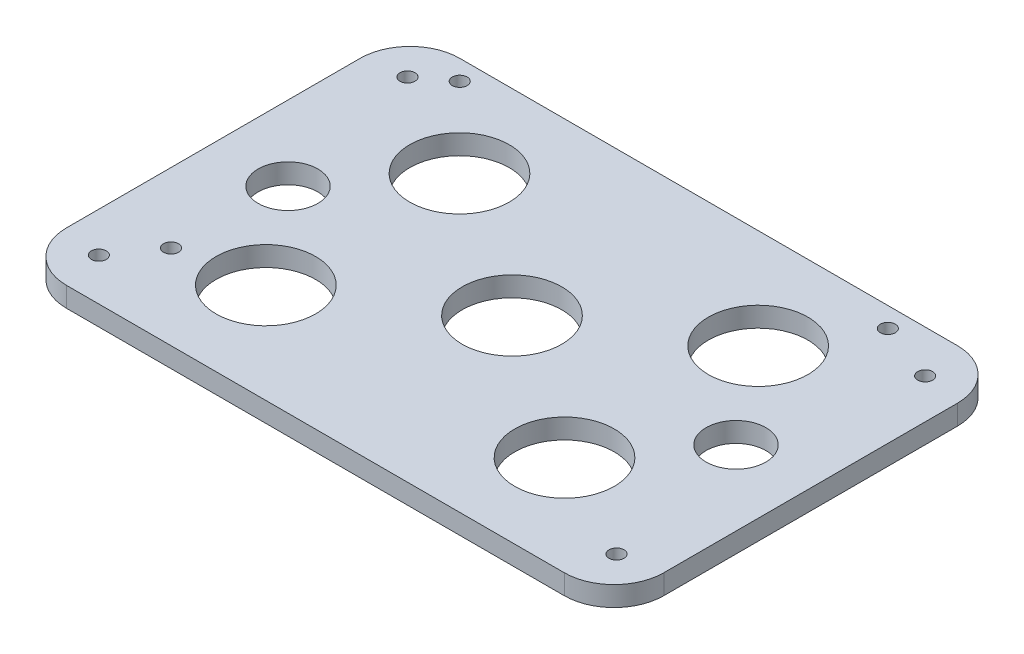
ISO-10303-21;
HEADER;
FILE_DESCRIPTION(('STEP AP214'),'2;1');
FILE_NAME('part.step','',(''),(''),'','','');
FILE_SCHEMA(('AUTOMOTIVE_DESIGN { 1 0 10303 214 1 1 1 1 }'));
ENDSEC;
DATA;
#1=APPLICATION_CONTEXT('core data for automotive mechanical design processes');
#2=APPLICATION_PROTOCOL_DEFINITION('international standard','automotive_design',2000,#1);
#3=PRODUCT_CONTEXT('',#1,'mechanical');
#4=PRODUCT('Part','Part','',(#3));
#5=PRODUCT_RELATED_PRODUCT_CATEGORY('part','',(#4));
#6=PRODUCT_DEFINITION_FORMATION('','',#4);
#7=PRODUCT_DEFINITION_CONTEXT('part definition',#1,'design');
#8=PRODUCT_DEFINITION('design','',#6,#7);
#9=PRODUCT_DEFINITION_SHAPE('','',#8);
#10=(LENGTH_UNIT() NAMED_UNIT(*) SI_UNIT(.MILLI.,.METRE.));
#11=(NAMED_UNIT(*) PLANE_ANGLE_UNIT() SI_UNIT($,.RADIAN.));
#12=(NAMED_UNIT(*) SI_UNIT($,.STERADIAN.) SOLID_ANGLE_UNIT());
#13=UNCERTAINTY_MEASURE_WITH_UNIT(LENGTH_MEASURE(1.E-05),#10,'distance_accuracy_value','');
#14=(GEOMETRIC_REPRESENTATION_CONTEXT(3) GLOBAL_UNCERTAINTY_ASSIGNED_CONTEXT((#13)) GLOBAL_UNIT_ASSIGNED_CONTEXT((#10,
#11,#12)) REPRESENTATION_CONTEXT('',''));
#15=CARTESIAN_POINT('',(0.,0.,0.));
#16=DIRECTION('',(0.,0.,1.));
#17=DIRECTION('',(1.,0.,0.));
#18=AXIS2_PLACEMENT_3D('',#15,#16,#17);
#19=CARTESIAN_POINT('',(-50.,4.,29.5));
#20=DIRECTION('',(0.,1.,0.));
#21=DIRECTION('',(0.,0.,1.));
#22=AXIS2_PLACEMENT_3D('',#19,#20,#21);
#23=PLANE('',#22);
#24=CARTESIAN_POINT('',(52.,4.,-31.));
#25=DIRECTION('',(0.,1.,0.));
#26=DIRECTION('',(0.,0.,1.));
#27=AXIS2_PLACEMENT_3D('',#24,#25,#26);
#28=CIRCLE('',#27,1.5);
#29=CARTESIAN_POINT('',(52.,4.,-29.5));
#30=VERTEX_POINT('',#29);
#31=EDGE_CURVE('E350',#30,#30,#28,.T.);
#32=ORIENTED_EDGE('',*,*,#31,.F.);
#33=EDGE_LOOP('',(#32));
#34=FACE_BOUND('',#33,.T.);
#35=CARTESIAN_POINT('',(52.,4.,31.));
#36=DIRECTION('',(0.,1.,0.));
#37=DIRECTION('',(0.,0.,1.));
#38=AXIS2_PLACEMENT_3D('',#35,#36,#37);
#39=CIRCLE('',#38,1.5);
#40=CARTESIAN_POINT('',(52.,4.,32.5));
#41=VERTEX_POINT('',#40);
#42=EDGE_CURVE('E346',#41,#41,#39,.T.);
#43=ORIENTED_EDGE('',*,*,#42,.F.);
#44=EDGE_LOOP('',(#43));
#45=FACE_BOUND('',#44,.T.);
#46=CARTESIAN_POINT('',(-52.,4.,31.));
#47=DIRECTION('',(0.,1.,0.));
#48=DIRECTION('',(0.,0.,1.));
#49=AXIS2_PLACEMENT_3D('',#46,#47,#48);
#50=CIRCLE('',#49,1.5);
#51=CARTESIAN_POINT('',(-52.,4.,32.5));
#52=VERTEX_POINT('',#51);
#53=EDGE_CURVE('E339',#52,#52,#50,.T.);
#54=ORIENTED_EDGE('',*,*,#53,.F.);
#55=EDGE_LOOP('',(#54));
#56=FACE_BOUND('',#55,.T.);
#57=CARTESIAN_POINT('',(-52.,4.,-31.));
#58=DIRECTION('',(0.,1.,0.));
#59=DIRECTION('',(0.,0.,1.));
#60=AXIS2_PLACEMENT_3D('',#57,#58,#59);
#61=CIRCLE('',#60,1.5);
#62=CARTESIAN_POINT('',(-52.,4.,-29.5));
#63=VERTEX_POINT('',#62);
#64=EDGE_CURVE('E167',#63,#63,#61,.T.);
#65=ORIENTED_EDGE('',*,*,#64,.F.);
#66=EDGE_LOOP('',(#65));
#67=FACE_BOUND('',#66,.T.);
#68=CARTESIAN_POINT('',(-45.,4.,0.));
#69=DIRECTION('',(0.,1.,0.));
#70=DIRECTION('',(0.,0.,1.));
#71=AXIS2_PLACEMENT_3D('',#68,#69,#70);
#72=CIRCLE('',#71,6.);
#73=CARTESIAN_POINT('',(-45.,4.,6.));
#74=VERTEX_POINT('',#73);
#75=EDGE_CURVE('E187',#74,#74,#72,.T.);
#76=ORIENTED_EDGE('',*,*,#75,.F.);
#77=EDGE_LOOP('',(#76));
#78=FACE_BOUND('',#77,.T.);
#79=CARTESIAN_POINT('',(-46.,4.,-35.5));
#80=DIRECTION('',(0.,1.,0.));
#81=DIRECTION('',(0.,0.,1.));
#82=AXIS2_PLACEMENT_3D('',#79,#80,#81);
#83=CIRCLE('',#82,1.5);
#84=CARTESIAN_POINT('',(-46.,4.,-34.));
#85=VERTEX_POINT('',#84);
#86=EDGE_CURVE('E199',#85,#85,#83,.T.);
#87=ORIENTED_EDGE('',*,*,#86,.F.);
#88=EDGE_LOOP('',(#87));
#89=FACE_BOUND('',#88,.T.);
#90=CARTESIAN_POINT('',(0.,4.,0.));
#91=DIRECTION('',(0.,1.,0.));
#92=DIRECTION('',(0.,0.,1.));
#93=AXIS2_PLACEMENT_3D('',#90,#91,#92);
#94=CIRCLE('',#93,10.);
#95=CARTESIAN_POINT('',(0.,4.,10.));
#96=VERTEX_POINT('',#95);
#97=EDGE_CURVE('E211',#96,#96,#94,.T.);
#98=ORIENTED_EDGE('',*,*,#97,.F.);
#99=EDGE_LOOP('',(#98));
#100=FACE_BOUND('',#99,.T.);
#101=CARTESIAN_POINT('',(30.,4.,-19.45));
#102=DIRECTION('',(0.,1.,0.));
#103=DIRECTION('',(0.,0.,1.));
#104=AXIS2_PLACEMENT_3D('',#101,#102,#103);
#105=CIRCLE('',#104,10.);
#106=CARTESIAN_POINT('',(30.,4.,-9.45));
#107=VERTEX_POINT('',#106);
#108=EDGE_CURVE('E223',#107,#107,#105,.T.);
#109=ORIENTED_EDGE('',*,*,#108,.F.);
#110=EDGE_LOOP('',(#109));
#111=FACE_BOUND('',#110,.T.);
#112=CARTESIAN_POINT('',(40.,4.,-35.5));
#113=DIRECTION('',(0.,1.,0.));
#114=DIRECTION('',(0.,0.,1.));
#115=AXIS2_PLACEMENT_3D('',#112,#113,#114);
#116=CIRCLE('',#115,1.5);
#117=CARTESIAN_POINT('',(40.,4.,-34.));
#118=VERTEX_POINT('',#117);
#119=EDGE_CURVE('E140',#118,#118,#116,.T.);
#120=ORIENTED_EDGE('',*,*,#119,.F.);
#121=EDGE_LOOP('',(#120));
#122=FACE_BOUND('',#121,.T.);
#123=CARTESIAN_POINT('',(-50.,4.,29.5));
#124=DIRECTION('',(0.,1.,0.));
#125=DIRECTION('',(0.,0.,1.));
#126=AXIS2_PLACEMENT_3D('',#123,#124,#125);
#127=CIRCLE('',#126,10.);
#128=CARTESIAN_POINT('',(-60.,4.,29.5));
#129=VERTEX_POINT('',#128);
#130=CARTESIAN_POINT('',(-50.,4.,39.5));
#131=VERTEX_POINT('',#130);
#132=EDGE_CURVE('E151',#129,#131,#127,.T.);
#133=ORIENTED_EDGE('',*,*,#132,.T.);
#134=DIRECTION('',(1.,0.,0.));
#135=VECTOR('',#134,1.);
#136=CARTESIAN_POINT('',(-50.,4.,39.5));
#137=LINE('',#136,#135);
#138=CARTESIAN_POINT('',(50.,4.,39.5));
#139=VERTEX_POINT('',#138);
#140=EDGE_CURVE('E99',#131,#139,#137,.T.);
#141=ORIENTED_EDGE('',*,*,#140,.T.);
#142=CARTESIAN_POINT('',(50.,4.,29.5));
#143=DIRECTION('',(0.,1.,0.));
#144=DIRECTION('',(0.,0.,1.));
#145=AXIS2_PLACEMENT_3D('',#142,#143,#144);
#146=CIRCLE('',#145,10.);
#147=CARTESIAN_POINT('',(60.,4.,29.5));
#148=VERTEX_POINT('',#147);
#149=EDGE_CURVE('E241',#139,#148,#146,.T.);
#150=ORIENTED_EDGE('',*,*,#149,.T.);
#151=DIRECTION('',(0.,0.,-1.));
#152=VECTOR('',#151,1.);
#153=CARTESIAN_POINT('',(60.,4.,29.5));
#154=LINE('',#153,#152);
#155=CARTESIAN_POINT('',(60.,4.,-29.5));
#156=VERTEX_POINT('',#155);
#157=EDGE_CURVE('E243',#148,#156,#154,.T.);
#158=ORIENTED_EDGE('',*,*,#157,.T.);
#159=CARTESIAN_POINT('',(50.,4.,-29.5));
#160=DIRECTION('',(0.,1.,0.));
#161=DIRECTION('',(0.,0.,1.));
#162=AXIS2_PLACEMENT_3D('',#159,#160,#161);
#163=CIRCLE('',#162,10.);
#164=CARTESIAN_POINT('',(50.,4.,-39.5));
#165=VERTEX_POINT('',#164);
#166=EDGE_CURVE('E118',#156,#165,#163,.T.);
#167=ORIENTED_EDGE('',*,*,#166,.T.);
#168=DIRECTION('',(-1.,0.,0.));
#169=VECTOR('',#168,1.);
#170=CARTESIAN_POINT('',(50.,4.,-39.5));
#171=LINE('',#170,#169);
#172=CARTESIAN_POINT('',(-50.,4.,-39.5));
#173=VERTEX_POINT('',#172);
#174=EDGE_CURVE('E112',#165,#173,#171,.T.);
#175=ORIENTED_EDGE('',*,*,#174,.T.);
#176=CARTESIAN_POINT('',(-50.,4.,-29.5));
#177=DIRECTION('',(0.,1.,0.));
#178=DIRECTION('',(0.,0.,1.));
#179=AXIS2_PLACEMENT_3D('',#176,#177,#178);
#180=CIRCLE('',#179,10.);
#181=CARTESIAN_POINT('',(-60.,4.,-29.5));
#182=VERTEX_POINT('',#181);
#183=EDGE_CURVE('E116',#173,#182,#180,.T.);
#184=ORIENTED_EDGE('',*,*,#183,.T.);
#185=DIRECTION('',(0.,0.,1.));
#186=VECTOR('',#185,1.);
#187=CARTESIAN_POINT('',(-60.,4.,-29.5));
#188=LINE('',#187,#186);
#189=EDGE_CURVE('E56',#182,#129,#188,.T.);
#190=ORIENTED_EDGE('',*,*,#189,.T.);
#191=EDGE_LOOP('',(#133,#141,#150,#158,#167,#175,#184,#190));
#192=FACE_BOUND('',#191,.T.);
#193=CARTESIAN_POINT('',(45.,4.,0.));
#194=DIRECTION('',(0.,1.,0.));
#195=DIRECTION('',(0.,0.,1.));
#196=AXIS2_PLACEMENT_3D('',#193,#194,#195);
#197=CIRCLE('',#196,6.);
#198=CARTESIAN_POINT('',(45.,4.,6.));
#199=VERTEX_POINT('',#198);
#200=EDGE_CURVE('E229',#199,#199,#197,.T.);
#201=ORIENTED_EDGE('',*,*,#200,.F.);
#202=EDGE_LOOP('',(#201));
#203=FACE_BOUND('',#202,.T.);
#204=CARTESIAN_POINT('',(30.,4.,19.45));
#205=DIRECTION('',(0.,1.,0.));
#206=DIRECTION('',(0.,0.,1.));
#207=AXIS2_PLACEMENT_3D('',#204,#205,#206);
#208=CIRCLE('',#207,10.);
#209=CARTESIAN_POINT('',(30.,4.,29.45));
#210=VERTEX_POINT('',#209);
#211=EDGE_CURVE('E217',#210,#210,#208,.T.);
#212=ORIENTED_EDGE('',*,*,#211,.F.);
#213=EDGE_LOOP('',(#212));
#214=FACE_BOUND('',#213,.T.);
#215=CARTESIAN_POINT('',(-30.,4.,19.45));
#216=DIRECTION('',(0.,1.,0.));
#217=DIRECTION('',(0.,0.,1.));
#218=AXIS2_PLACEMENT_3D('',#215,#216,#217);
#219=CIRCLE('',#218,10.);
#220=CARTESIAN_POINT('',(-30.,4.,29.45));
#221=VERTEX_POINT('',#220);
#222=EDGE_CURVE('E205',#221,#221,#219,.T.);
#223=ORIENTED_EDGE('',*,*,#222,.F.);
#224=EDGE_LOOP('',(#223));
#225=FACE_BOUND('',#224,.T.);
#226=CARTESIAN_POINT('',(-46.,4.,22.5));
#227=DIRECTION('',(0.,1.,0.));
#228=DIRECTION('',(0.,0.,1.));
#229=AXIS2_PLACEMENT_3D('',#226,#227,#228);
#230=CIRCLE('',#229,1.5);
#231=CARTESIAN_POINT('',(-46.,4.,24.));
#232=VERTEX_POINT('',#231);
#233=EDGE_CURVE('E193',#232,#232,#230,.T.);
#234=ORIENTED_EDGE('',*,*,#233,.F.);
#235=EDGE_LOOP('',(#234));
#236=FACE_BOUND('',#235,.T.);
#237=CARTESIAN_POINT('',(-30.,4.,-19.45));
#238=DIRECTION('',(0.,1.,0.));
#239=DIRECTION('',(0.,0.,1.));
#240=AXIS2_PLACEMENT_3D('',#237,#238,#239);
#241=CIRCLE('',#240,10.);
#242=CARTESIAN_POINT('',(-30.,4.,-9.45));
#243=VERTEX_POINT('',#242);
#244=EDGE_CURVE('E178',#243,#243,#241,.T.);
#245=ORIENTED_EDGE('',*,*,#244,.F.);
#246=EDGE_LOOP('',(#245));
#247=FACE_BOUND('',#246,.T.);
#248=ADVANCED_FACE('F37',(#34,#45,#56,#67,#78,#89,#100,#111,#122,#192,#203,#214,#225,#236,#247),
#23,.T.);
#249=CARTESIAN_POINT('',(-50.,0.,29.5));
#250=DIRECTION('',(0.,1.,0.));
#251=DIRECTION('',(0.,0.,1.));
#252=AXIS2_PLACEMENT_3D('',#249,#250,#251);
#253=PLANE('',#252);
#254=CARTESIAN_POINT('',(52.,0.,-31.));
#255=DIRECTION('',(0.,1.,0.));
#256=DIRECTION('',(0.,0.,1.));
#257=AXIS2_PLACEMENT_3D('',#254,#255,#256);
#258=CIRCLE('',#257,1.5);
#259=CARTESIAN_POINT('',(52.,0.,-29.5));
#260=VERTEX_POINT('',#259);
#261=EDGE_CURVE('E41',#260,#260,#258,.T.);
#262=ORIENTED_EDGE('',*,*,#261,.T.);
#263=EDGE_LOOP('',(#262));
#264=FACE_BOUND('',#263,.T.);
#265=CARTESIAN_POINT('',(52.,0.,31.));
#266=DIRECTION('',(0.,1.,0.));
#267=DIRECTION('',(0.,0.,1.));
#268=AXIS2_PLACEMENT_3D('',#265,#266,#267);
#269=CIRCLE('',#268,1.5);
#270=CARTESIAN_POINT('',(52.,0.,32.5));
#271=VERTEX_POINT('',#270);
#272=EDGE_CURVE('E169',#271,#271,#269,.T.);
#273=ORIENTED_EDGE('',*,*,#272,.T.);
#274=EDGE_LOOP('',(#273));
#275=FACE_BOUND('',#274,.T.);
#276=CARTESIAN_POINT('',(-52.,0.,31.));
#277=DIRECTION('',(0.,1.,0.));
#278=DIRECTION('',(0.,0.,1.));
#279=AXIS2_PLACEMENT_3D('',#276,#277,#278);
#280=CIRCLE('',#279,1.5);
#281=CARTESIAN_POINT('',(-52.,0.,32.5));
#282=VERTEX_POINT('',#281);
#283=EDGE_CURVE('E166',#282,#282,#280,.T.);
#284=ORIENTED_EDGE('',*,*,#283,.T.);
#285=EDGE_LOOP('',(#284));
#286=FACE_BOUND('',#285,.T.);
#287=CARTESIAN_POINT('',(-52.,0.,-31.));
#288=DIRECTION('',(0.,1.,0.));
#289=DIRECTION('',(0.,0.,1.));
#290=AXIS2_PLACEMENT_3D('',#287,#288,#289);
#291=CIRCLE('',#290,1.5);
#292=CARTESIAN_POINT('',(-52.,0.,-29.5));
#293=VERTEX_POINT('',#292);
#294=EDGE_CURVE('E163',#293,#293,#291,.T.);
#295=ORIENTED_EDGE('',*,*,#294,.T.);
#296=EDGE_LOOP('',(#295));
#297=FACE_BOUND('',#296,.T.);
#298=CARTESIAN_POINT('',(-50.,0.,29.5));
#299=DIRECTION('',(0.,1.,0.));
#300=DIRECTION('',(0.,0.,1.));
#301=AXIS2_PLACEMENT_3D('',#298,#299,#300);
#302=CIRCLE('',#301,10.);
#303=CARTESIAN_POINT('',(-60.,0.,29.5));
#304=VERTEX_POINT('',#303);
#305=CARTESIAN_POINT('',(-50.,0.,39.5));
#306=VERTEX_POINT('',#305);
#307=EDGE_CURVE('E136',#304,#306,#302,.T.);
#308=ORIENTED_EDGE('',*,*,#307,.F.);
#309=DIRECTION('',(0.,0.,1.));
#310=VECTOR('',#309,1.);
#311=CARTESIAN_POINT('',(-60.,0.,-29.5));
#312=LINE('',#311,#310);
#313=CARTESIAN_POINT('',(-60.,0.,-29.5));
#314=VERTEX_POINT('',#313);
#315=EDGE_CURVE('E91',#314,#304,#312,.T.);
#316=ORIENTED_EDGE('',*,*,#315,.F.);
#317=CARTESIAN_POINT('',(-50.,0.,-29.5));
#318=DIRECTION('',(0.,1.,0.));
#319=DIRECTION('',(0.,0.,1.));
#320=AXIS2_PLACEMENT_3D('',#317,#318,#319);
#321=CIRCLE('',#320,10.);
#322=CARTESIAN_POINT('',(-50.,0.,-39.5));
#323=VERTEX_POINT('',#322);
#324=EDGE_CURVE('E85',#323,#314,#321,.T.);
#325=ORIENTED_EDGE('',*,*,#324,.F.);
#326=DIRECTION('',(-1.,0.,0.));
#327=VECTOR('',#326,1.);
#328=CARTESIAN_POINT('',(50.,0.,-39.5));
#329=LINE('',#328,#327);
#330=CARTESIAN_POINT('',(50.,0.,-39.5));
#331=VERTEX_POINT('',#330);
#332=EDGE_CURVE('E126',#331,#323,#329,.T.);
#333=ORIENTED_EDGE('',*,*,#332,.F.);
#334=CARTESIAN_POINT('',(50.,0.,-29.5));
#335=DIRECTION('',(0.,1.,0.));
#336=DIRECTION('',(0.,0.,1.));
#337=AXIS2_PLACEMENT_3D('',#334,#335,#336);
#338=CIRCLE('',#337,10.);
#339=CARTESIAN_POINT('',(60.,0.,-29.5));
#340=VERTEX_POINT('',#339);
#341=EDGE_CURVE('E146',#340,#331,#338,.T.);
#342=ORIENTED_EDGE('',*,*,#341,.F.);
#343=DIRECTION('',(0.,0.,-1.));
#344=VECTOR('',#343,1.);
#345=CARTESIAN_POINT('',(60.,0.,29.5));
#346=LINE('',#345,#344);
#347=CARTESIAN_POINT('',(60.,0.,29.5));
#348=VERTEX_POINT('',#347);
#349=EDGE_CURVE('E144',#348,#340,#346,.T.);
#350=ORIENTED_EDGE('',*,*,#349,.F.);
#351=CARTESIAN_POINT('',(50.,0.,29.5));
#352=DIRECTION('',(0.,1.,0.));
#353=DIRECTION('',(0.,0.,1.));
#354=AXIS2_PLACEMENT_3D('',#351,#352,#353);
#355=CIRCLE('',#354,10.);
#356=CARTESIAN_POINT('',(50.,0.,39.5));
#357=VERTEX_POINT('',#356);
#358=EDGE_CURVE('E142',#357,#348,#355,.T.);
#359=ORIENTED_EDGE('',*,*,#358,.F.);
#360=DIRECTION('',(1.,0.,0.));
#361=VECTOR('',#360,1.);
#362=CARTESIAN_POINT('',(-50.,0.,39.5));
#363=LINE('',#362,#361);
#364=EDGE_CURVE('E139',#306,#357,#363,.T.);
#365=ORIENTED_EDGE('',*,*,#364,.F.);
#366=EDGE_LOOP('',(#308,#316,#325,#333,#342,#350,#359,#365));
#367=FACE_BOUND('',#366,.T.);
#368=CARTESIAN_POINT('',(40.,0.,-35.5));
#369=DIRECTION('',(0.,1.,0.));
#370=DIRECTION('',(0.,0.,1.));
#371=AXIS2_PLACEMENT_3D('',#368,#369,#370);
#372=CIRCLE('',#371,1.5);
#373=CARTESIAN_POINT('',(40.,0.,-34.));
#374=VERTEX_POINT('',#373);
#375=EDGE_CURVE('E232',#374,#374,#372,.T.);
#376=ORIENTED_EDGE('',*,*,#375,.T.);
#377=EDGE_LOOP('',(#376));
#378=FACE_BOUND('',#377,.T.);
#379=CARTESIAN_POINT('',(45.,0.,0.));
#380=DIRECTION('',(0.,1.,0.));
#381=DIRECTION('',(0.,0.,1.));
#382=AXIS2_PLACEMENT_3D('',#379,#380,#381);
#383=CIRCLE('',#382,6.);
#384=CARTESIAN_POINT('',(45.,0.,6.));
#385=VERTEX_POINT('',#384);
#386=EDGE_CURVE('E226',#385,#385,#383,.T.);
#387=ORIENTED_EDGE('',*,*,#386,.T.);
#388=EDGE_LOOP('',(#387));
#389=FACE_BOUND('',#388,.T.);
#390=CARTESIAN_POINT('',(30.,0.,-19.45));
#391=DIRECTION('',(0.,1.,0.));
#392=DIRECTION('',(0.,0.,1.));
#393=AXIS2_PLACEMENT_3D('',#390,#391,#392);
#394=CIRCLE('',#393,10.);
#395=CARTESIAN_POINT('',(30.,0.,-9.45));
#396=VERTEX_POINT('',#395);
#397=EDGE_CURVE('E220',#396,#396,#394,.T.);
#398=ORIENTED_EDGE('',*,*,#397,.T.);
#399=EDGE_LOOP('',(#398));
#400=FACE_BOUND('',#399,.T.);
#401=CARTESIAN_POINT('',(30.,0.,19.45));
#402=DIRECTION('',(0.,1.,0.));
#403=DIRECTION('',(0.,0.,1.));
#404=AXIS2_PLACEMENT_3D('',#401,#402,#403);
#405=CIRCLE('',#404,10.);
#406=CARTESIAN_POINT('',(30.,0.,29.45));
#407=VERTEX_POINT('',#406);
#408=EDGE_CURVE('E214',#407,#407,#405,.T.);
#409=ORIENTED_EDGE('',*,*,#408,.T.);
#410=EDGE_LOOP('',(#409));
#411=FACE_BOUND('',#410,.T.);
#412=CARTESIAN_POINT('',(0.,0.,0.));
#413=DIRECTION('',(0.,1.,0.));
#414=DIRECTION('',(0.,0.,1.));
#415=AXIS2_PLACEMENT_3D('',#412,#413,#414);
#416=CIRCLE('',#415,10.);
#417=CARTESIAN_POINT('',(0.,0.,10.));
#418=VERTEX_POINT('',#417);
#419=EDGE_CURVE('E208',#418,#418,#416,.T.);
#420=ORIENTED_EDGE('',*,*,#419,.T.);
#421=EDGE_LOOP('',(#420));
#422=FACE_BOUND('',#421,.T.);
#423=CARTESIAN_POINT('',(-30.,0.,19.45));
#424=DIRECTION('',(0.,1.,0.));
#425=DIRECTION('',(0.,0.,1.));
#426=AXIS2_PLACEMENT_3D('',#423,#424,#425);
#427=CIRCLE('',#426,10.);
#428=CARTESIAN_POINT('',(-30.,0.,29.45));
#429=VERTEX_POINT('',#428);
#430=EDGE_CURVE('E202',#429,#429,#427,.T.);
#431=ORIENTED_EDGE('',*,*,#430,.T.);
#432=EDGE_LOOP('',(#431));
#433=FACE_BOUND('',#432,.T.);
#434=CARTESIAN_POINT('',(-46.,0.,-35.5));
#435=DIRECTION('',(0.,1.,0.));
#436=DIRECTION('',(0.,0.,1.));
#437=AXIS2_PLACEMENT_3D('',#434,#435,#436);
#438=CIRCLE('',#437,1.5);
#439=CARTESIAN_POINT('',(-46.,0.,-34.));
#440=VERTEX_POINT('',#439);
#441=EDGE_CURVE('E196',#440,#440,#438,.T.);
#442=ORIENTED_EDGE('',*,*,#441,.T.);
#443=EDGE_LOOP('',(#442));
#444=FACE_BOUND('',#443,.T.);
#445=CARTESIAN_POINT('',(-46.,0.,22.5));
#446=DIRECTION('',(0.,1.,0.));
#447=DIRECTION('',(0.,0.,1.));
#448=AXIS2_PLACEMENT_3D('',#445,#446,#447);
#449=CIRCLE('',#448,1.5);
#450=CARTESIAN_POINT('',(-46.,0.,24.));
#451=VERTEX_POINT('',#450);
#452=EDGE_CURVE('E190',#451,#451,#449,.T.);
#453=ORIENTED_EDGE('',*,*,#452,.T.);
#454=EDGE_LOOP('',(#453));
#455=FACE_BOUND('',#454,.T.);
#456=CARTESIAN_POINT('',(-45.,0.,0.));
#457=DIRECTION('',(0.,1.,0.));
#458=DIRECTION('',(0.,0.,1.));
#459=AXIS2_PLACEMENT_3D('',#456,#457,#458);
#460=CIRCLE('',#459,6.);
#461=CARTESIAN_POINT('',(-45.,0.,6.));
#462=VERTEX_POINT('',#461);
#463=EDGE_CURVE('E183',#462,#462,#460,.T.);
#464=ORIENTED_EDGE('',*,*,#463,.T.);
#465=EDGE_LOOP('',(#464));
#466=FACE_BOUND('',#465,.T.);
#467=CARTESIAN_POINT('',(-30.,0.,-19.45));
#468=DIRECTION('',(0.,1.,0.));
#469=DIRECTION('',(0.,0.,1.));
#470=AXIS2_PLACEMENT_3D('',#467,#468,#469);
#471=CIRCLE('',#470,10.);
#472=CARTESIAN_POINT('',(-30.,0.,-9.45));
#473=VERTEX_POINT('',#472);
#474=EDGE_CURVE('E174',#473,#473,#471,.T.);
#475=ORIENTED_EDGE('',*,*,#474,.T.);
#476=EDGE_LOOP('',(#475));
#477=FACE_BOUND('',#476,.T.);
#478=ADVANCED_FACE('F256',(#264,#275,#286,#297,#367,#378,#389,#400,#411,#422,#433,#444,#455,
#466,#477),#253,.F.);
#479=CARTESIAN_POINT('',(-50.,4.,29.5));
#480=DIRECTION('',(0.,-1.,0.));
#481=DIRECTION('',(0.,0.,-1.));
#482=AXIS2_PLACEMENT_3D('',#479,#480,#481);
#483=CYLINDRICAL_SURFACE('',#482,10.);
#484=ORIENTED_EDGE('',*,*,#307,.T.);
#485=DIRECTION('',(0.,-1.,0.));
#486=VECTOR('',#485,1.);
#487=CARTESIAN_POINT('',(-50.,4.,39.5));
#488=LINE('',#487,#486);
#489=EDGE_CURVE('E11',#131,#306,#488,.T.);
#490=ORIENTED_EDGE('',*,*,#489,.F.);
#491=ORIENTED_EDGE('',*,*,#132,.F.);
#492=DIRECTION('',(0.,-1.,0.));
#493=VECTOR('',#492,1.);
#494=CARTESIAN_POINT('',(-60.,4.,29.5));
#495=LINE('',#494,#493);
#496=EDGE_CURVE('E132',#129,#304,#495,.T.);
#497=ORIENTED_EDGE('',*,*,#496,.T.);
#498=EDGE_LOOP('',(#484,#490,#491,#497));
#499=FACE_BOUND('',#498,.T.);
#500=ADVANCED_FACE('F39',(#499),#483,.T.);
#501=CARTESIAN_POINT('',(-50.,4.,39.5));
#502=DIRECTION('',(0.,0.,-1.));
#503=DIRECTION('',(-1.,0.,0.));
#504=AXIS2_PLACEMENT_3D('',#501,#502,#503);
#505=PLANE('',#504);
#506=ORIENTED_EDGE('',*,*,#364,.T.);
#507=DIRECTION('',(0.,-1.,0.));
#508=VECTOR('',#507,1.);
#509=CARTESIAN_POINT('',(50.,4.,39.5));
#510=LINE('',#509,#508);
#511=EDGE_CURVE('E47',#139,#357,#510,.T.);
#512=ORIENTED_EDGE('',*,*,#511,.F.);
#513=ORIENTED_EDGE('',*,*,#140,.F.);
#514=ORIENTED_EDGE('',*,*,#489,.T.);
#515=EDGE_LOOP('',(#506,#512,#513,#514));
#516=FACE_BOUND('',#515,.T.);
#517=ADVANCED_FACE('F505',(#516),#505,.F.);
#518=CARTESIAN_POINT('',(50.,4.,29.5));
#519=DIRECTION('',(0.,-1.,0.));
#520=DIRECTION('',(0.,0.,-1.));
#521=AXIS2_PLACEMENT_3D('',#518,#519,#520);
#522=CYLINDRICAL_SURFACE('',#521,10.);
#523=ORIENTED_EDGE('',*,*,#358,.T.);
#524=DIRECTION('',(0.,-1.,0.));
#525=VECTOR('',#524,1.);
#526=CARTESIAN_POINT('',(60.,4.,29.5));
#527=LINE('',#526,#525);
#528=EDGE_CURVE('E158',#148,#348,#527,.T.);
#529=ORIENTED_EDGE('',*,*,#528,.F.);
#530=ORIENTED_EDGE('',*,*,#149,.F.);
#531=ORIENTED_EDGE('',*,*,#511,.T.);
#532=EDGE_LOOP('',(#523,#529,#530,#531));
#533=FACE_BOUND('',#532,.T.);
#534=ADVANCED_FACE('F497',(#533),#522,.T.);
#535=CARTESIAN_POINT('',(60.,4.,29.5));
#536=DIRECTION('',(-1.,0.,0.));
#537=DIRECTION('',(0.,0.,1.));
#538=AXIS2_PLACEMENT_3D('',#535,#536,#537);
#539=PLANE('',#538);
#540=ORIENTED_EDGE('',*,*,#349,.T.);
#541=DIRECTION('',(0.,-1.,0.));
#542=VECTOR('',#541,1.);
#543=CARTESIAN_POINT('',(60.,4.,-29.5));
#544=LINE('',#543,#542);
#545=EDGE_CURVE('E155',#156,#340,#544,.T.);
#546=ORIENTED_EDGE('',*,*,#545,.F.);
#547=ORIENTED_EDGE('',*,*,#157,.F.);
#548=ORIENTED_EDGE('',*,*,#528,.T.);
#549=EDGE_LOOP('',(#540,#546,#547,#548));
#550=FACE_BOUND('',#549,.T.);
#551=ADVANCED_FACE('F249',(#550),#539,.F.);
#552=CARTESIAN_POINT('',(50.,4.,-29.5));
#553=DIRECTION('',(0.,-1.,0.));
#554=DIRECTION('',(0.,0.,-1.));
#555=AXIS2_PLACEMENT_3D('',#552,#553,#554);
#556=CYLINDRICAL_SURFACE('',#555,10.);
#557=ORIENTED_EDGE('',*,*,#341,.T.);
#558=DIRECTION('',(0.,-1.,0.));
#559=VECTOR('',#558,1.);
#560=CARTESIAN_POINT('',(50.,4.,-39.5));
#561=LINE('',#560,#559);
#562=EDGE_CURVE('E127',#165,#331,#561,.T.);
#563=ORIENTED_EDGE('',*,*,#562,.F.);
#564=ORIENTED_EDGE('',*,*,#166,.F.);
#565=ORIENTED_EDGE('',*,*,#545,.T.);
#566=EDGE_LOOP('',(#557,#563,#564,#565));
#567=FACE_BOUND('',#566,.T.);
#568=ADVANCED_FACE('F253',(#567),#556,.T.);
#569=CARTESIAN_POINT('',(50.,4.,-39.5));
#570=DIRECTION('',(0.,0.,1.));
#571=DIRECTION('',(1.,0.,0.));
#572=AXIS2_PLACEMENT_3D('',#569,#570,#571);
#573=PLANE('',#572);
#574=ORIENTED_EDGE('',*,*,#332,.T.);
#575=DIRECTION('',(0.,-1.,0.));
#576=VECTOR('',#575,1.);
#577=CARTESIAN_POINT('',(-50.,4.,-39.5));
#578=LINE('',#577,#576);
#579=EDGE_CURVE('E123',#173,#323,#578,.T.);
#580=ORIENTED_EDGE('',*,*,#579,.F.);
#581=ORIENTED_EDGE('',*,*,#174,.F.);
#582=ORIENTED_EDGE('',*,*,#562,.T.);
#583=EDGE_LOOP('',(#574,#580,#581,#582));
#584=FACE_BOUND('',#583,.T.);
#585=ADVANCED_FACE('F124',(#584),#573,.F.);
#586=CARTESIAN_POINT('',(-50.,4.,-29.5));
#587=DIRECTION('',(0.,-1.,0.));
#588=DIRECTION('',(0.,0.,-1.));
#589=AXIS2_PLACEMENT_3D('',#586,#587,#588);
#590=CYLINDRICAL_SURFACE('',#589,10.);
#591=ORIENTED_EDGE('',*,*,#324,.T.);
#592=DIRECTION('',(0.,-1.,0.));
#593=VECTOR('',#592,1.);
#594=CARTESIAN_POINT('',(-60.,4.,-29.5));
#595=LINE('',#594,#593);
#596=EDGE_CURVE('E128',#182,#314,#595,.T.);
#597=ORIENTED_EDGE('',*,*,#596,.F.);
#598=ORIENTED_EDGE('',*,*,#183,.F.);
#599=ORIENTED_EDGE('',*,*,#579,.T.);
#600=EDGE_LOOP('',(#591,#597,#598,#599));
#601=FACE_BOUND('',#600,.T.);
#602=ADVANCED_FACE('F130',(#601),#590,.T.);
#603=CARTESIAN_POINT('',(-60.,4.,-29.5));
#604=DIRECTION('',(1.,0.,0.));
#605=DIRECTION('',(0.,0.,-1.));
#606=AXIS2_PLACEMENT_3D('',#603,#604,#605);
#607=PLANE('',#606);
#608=ORIENTED_EDGE('',*,*,#315,.T.);
#609=ORIENTED_EDGE('',*,*,#496,.F.);
#610=ORIENTED_EDGE('',*,*,#189,.F.);
#611=ORIENTED_EDGE('',*,*,#596,.T.);
#612=EDGE_LOOP('',(#608,#609,#610,#611));
#613=FACE_BOUND('',#612,.T.);
#614=ADVANCED_FACE('F262',(#613),#607,.F.);
#615=CARTESIAN_POINT('',(40.,4.,-35.5));
#616=DIRECTION('',(0.,-1.,0.));
#617=DIRECTION('',(0.,0.,-1.));
#618=AXIS2_PLACEMENT_3D('',#615,#616,#617);
#619=CYLINDRICAL_SURFACE('',#618,1.5);
#620=ORIENTED_EDGE('',*,*,#119,.T.);
#621=EDGE_LOOP('',(#620));
#622=FACE_BOUND('',#621,.T.);
#623=ORIENTED_EDGE('',*,*,#375,.F.);
#624=EDGE_LOOP('',(#623));
#625=FACE_BOUND('',#624,.T.);
#626=ADVANCED_FACE('F264',(#622,#625),#619,.F.);
#627=CARTESIAN_POINT('',(45.,4.,0.));
#628=DIRECTION('',(0.,-1.,0.));
#629=DIRECTION('',(0.,0.,-1.));
#630=AXIS2_PLACEMENT_3D('',#627,#628,#629);
#631=CYLINDRICAL_SURFACE('',#630,6.);
#632=ORIENTED_EDGE('',*,*,#200,.T.);
#633=EDGE_LOOP('',(#632));
#634=FACE_BOUND('',#633,.T.);
#635=ORIENTED_EDGE('',*,*,#386,.F.);
#636=EDGE_LOOP('',(#635));
#637=FACE_BOUND('',#636,.T.);
#638=ADVANCED_FACE('F270',(#634,#637),#631,.F.);
#639=CARTESIAN_POINT('',(30.,4.,-19.45));
#640=DIRECTION('',(0.,-1.,0.));
#641=DIRECTION('',(0.,0.,-1.));
#642=AXIS2_PLACEMENT_3D('',#639,#640,#641);
#643=CYLINDRICAL_SURFACE('',#642,10.);
#644=ORIENTED_EDGE('',*,*,#108,.T.);
#645=EDGE_LOOP('',(#644));
#646=FACE_BOUND('',#645,.T.);
#647=ORIENTED_EDGE('',*,*,#397,.F.);
#648=EDGE_LOOP('',(#647));
#649=FACE_BOUND('',#648,.T.);
#650=ADVANCED_FACE('F286',(#646,#649),#643,.F.);
#651=CARTESIAN_POINT('',(30.,4.,19.45));
#652=DIRECTION('',(0.,-1.,0.));
#653=DIRECTION('',(0.,0.,-1.));
#654=AXIS2_PLACEMENT_3D('',#651,#652,#653);
#655=CYLINDRICAL_SURFACE('',#654,10.);
#656=ORIENTED_EDGE('',*,*,#211,.T.);
#657=EDGE_LOOP('',(#656));
#658=FACE_BOUND('',#657,.T.);
#659=ORIENTED_EDGE('',*,*,#408,.F.);
#660=EDGE_LOOP('',(#659));
#661=FACE_BOUND('',#660,.T.);
#662=ADVANCED_FACE('F290',(#658,#661),#655,.F.);
#663=CARTESIAN_POINT('',(0.,4.,0.));
#664=DIRECTION('',(0.,-1.,0.));
#665=DIRECTION('',(0.,0.,-1.));
#666=AXIS2_PLACEMENT_3D('',#663,#664,#665);
#667=CYLINDRICAL_SURFACE('',#666,10.);
#668=ORIENTED_EDGE('',*,*,#97,.T.);
#669=EDGE_LOOP('',(#668));
#670=FACE_BOUND('',#669,.T.);
#671=ORIENTED_EDGE('',*,*,#419,.F.);
#672=EDGE_LOOP('',(#671));
#673=FACE_BOUND('',#672,.T.);
#674=ADVANCED_FACE('F294',(#670,#673),#667,.F.);
#675=CARTESIAN_POINT('',(-30.,4.,19.45));
#676=DIRECTION('',(0.,-1.,0.));
#677=DIRECTION('',(0.,0.,-1.));
#678=AXIS2_PLACEMENT_3D('',#675,#676,#677);
#679=CYLINDRICAL_SURFACE('',#678,10.);
#680=ORIENTED_EDGE('',*,*,#222,.T.);
#681=EDGE_LOOP('',(#680));
#682=FACE_BOUND('',#681,.T.);
#683=ORIENTED_EDGE('',*,*,#430,.F.);
#684=EDGE_LOOP('',(#683));
#685=FACE_BOUND('',#684,.T.);
#686=ADVANCED_FACE('F298',(#682,#685),#679,.F.);
#687=CARTESIAN_POINT('',(-46.,4.,-35.5));
#688=DIRECTION('',(0.,-1.,0.));
#689=DIRECTION('',(0.,0.,-1.));
#690=AXIS2_PLACEMENT_3D('',#687,#688,#689);
#691=CYLINDRICAL_SURFACE('',#690,1.5);
#692=ORIENTED_EDGE('',*,*,#86,.T.);
#693=EDGE_LOOP('',(#692));
#694=FACE_BOUND('',#693,.T.);
#695=ORIENTED_EDGE('',*,*,#441,.F.);
#696=EDGE_LOOP('',(#695));
#697=FACE_BOUND('',#696,.T.);
#698=ADVANCED_FACE('F302',(#694,#697),#691,.F.);
#699=CARTESIAN_POINT('',(-46.,4.,22.5));
#700=DIRECTION('',(0.,-1.,0.));
#701=DIRECTION('',(0.,0.,-1.));
#702=AXIS2_PLACEMENT_3D('',#699,#700,#701);
#703=CYLINDRICAL_SURFACE('',#702,1.5);
#704=ORIENTED_EDGE('',*,*,#233,.T.);
#705=EDGE_LOOP('',(#704));
#706=FACE_BOUND('',#705,.T.);
#707=ORIENTED_EDGE('',*,*,#452,.F.);
#708=EDGE_LOOP('',(#707));
#709=FACE_BOUND('',#708,.T.);
#710=ADVANCED_FACE('F306',(#706,#709),#703,.F.);
#711=CARTESIAN_POINT('',(-45.,4.,0.));
#712=DIRECTION('',(0.,-1.,0.));
#713=DIRECTION('',(0.,0.,-1.));
#714=AXIS2_PLACEMENT_3D('',#711,#712,#713);
#715=CYLINDRICAL_SURFACE('',#714,6.);
#716=ORIENTED_EDGE('',*,*,#75,.T.);
#717=EDGE_LOOP('',(#716));
#718=FACE_BOUND('',#717,.T.);
#719=ORIENTED_EDGE('',*,*,#463,.F.);
#720=EDGE_LOOP('',(#719));
#721=FACE_BOUND('',#720,.T.);
#722=ADVANCED_FACE('F310',(#718,#721),#715,.F.);
#723=CARTESIAN_POINT('',(-30.,4.,-19.45));
#724=DIRECTION('',(0.,-1.,0.));
#725=DIRECTION('',(0.,0.,-1.));
#726=AXIS2_PLACEMENT_3D('',#723,#724,#725);
#727=CYLINDRICAL_SURFACE('',#726,10.);
#728=ORIENTED_EDGE('',*,*,#244,.T.);
#729=EDGE_LOOP('',(#728));
#730=FACE_BOUND('',#729,.T.);
#731=ORIENTED_EDGE('',*,*,#474,.F.);
#732=EDGE_LOOP('',(#731));
#733=FACE_BOUND('',#732,.T.);
#734=ADVANCED_FACE('F314',(#730,#733),#727,.F.);
#735=CARTESIAN_POINT('',(-52.,-21.,-31.));
#736=DIRECTION('',(0.,1.,0.));
#737=DIRECTION('',(0.,0.,1.));
#738=AXIS2_PLACEMENT_3D('',#735,#736,#737);
#739=CYLINDRICAL_SURFACE('',#738,1.5);
#740=ORIENTED_EDGE('',*,*,#64,.T.);
#741=EDGE_LOOP('',(#740));
#742=FACE_BOUND('',#741,.T.);
#743=ORIENTED_EDGE('',*,*,#294,.F.);
#744=EDGE_LOOP('',(#743));
#745=FACE_BOUND('',#744,.T.);
#746=ADVANCED_FACE('F318',(#742,#745),#739,.F.);
#747=CARTESIAN_POINT('',(-52.,-21.,31.));
#748=DIRECTION('',(0.,1.,0.));
#749=DIRECTION('',(0.,0.,1.));
#750=AXIS2_PLACEMENT_3D('',#747,#748,#749);
#751=CYLINDRICAL_SURFACE('',#750,1.5);
#752=ORIENTED_EDGE('',*,*,#53,.T.);
#753=EDGE_LOOP('',(#752));
#754=FACE_BOUND('',#753,.T.);
#755=ORIENTED_EDGE('',*,*,#283,.F.);
#756=EDGE_LOOP('',(#755));
#757=FACE_BOUND('',#756,.T.);
#758=ADVANCED_FACE('F322',(#754,#757),#751,.F.);
#759=CARTESIAN_POINT('',(52.,-21.,31.));
#760=DIRECTION('',(0.,1.,0.));
#761=DIRECTION('',(0.,0.,1.));
#762=AXIS2_PLACEMENT_3D('',#759,#760,#761);
#763=CYLINDRICAL_SURFACE('',#762,1.5);
#764=ORIENTED_EDGE('',*,*,#42,.T.);
#765=EDGE_LOOP('',(#764));
#766=FACE_BOUND('',#765,.T.);
#767=ORIENTED_EDGE('',*,*,#272,.F.);
#768=EDGE_LOOP('',(#767));
#769=FACE_BOUND('',#768,.T.);
#770=ADVANCED_FACE('F327',(#766,#769),#763,.F.);
#771=CARTESIAN_POINT('',(52.,-21.,-31.));
#772=DIRECTION('',(0.,1.,0.));
#773=DIRECTION('',(0.,0.,1.));
#774=AXIS2_PLACEMENT_3D('',#771,#772,#773);
#775=CYLINDRICAL_SURFACE('',#774,1.5);
#776=ORIENTED_EDGE('',*,*,#31,.T.);
#777=EDGE_LOOP('',(#776));
#778=FACE_BOUND('',#777,.T.);
#779=ORIENTED_EDGE('',*,*,#261,.F.);
#780=EDGE_LOOP('',(#779));
#781=FACE_BOUND('',#780,.T.);
#782=ADVANCED_FACE('F324',(#778,#781),#775,.F.);
#783=CLOSED_SHELL('',(#248,#478,#500,#517,#534,#551,#568,#585,#602,#614,#626,#638,#650,#662,
#674,#686,#698,#710,#722,#734,#746,#758,#770,#782));
#784=MANIFOLD_SOLID_BREP('B2',#783);
#785=ADVANCED_BREP_SHAPE_REPRESENTATION('',(#18,#784),#14);
#786=SHAPE_DEFINITION_REPRESENTATION(#9,#785);
ENDSEC;
END-ISO-10303-21;
